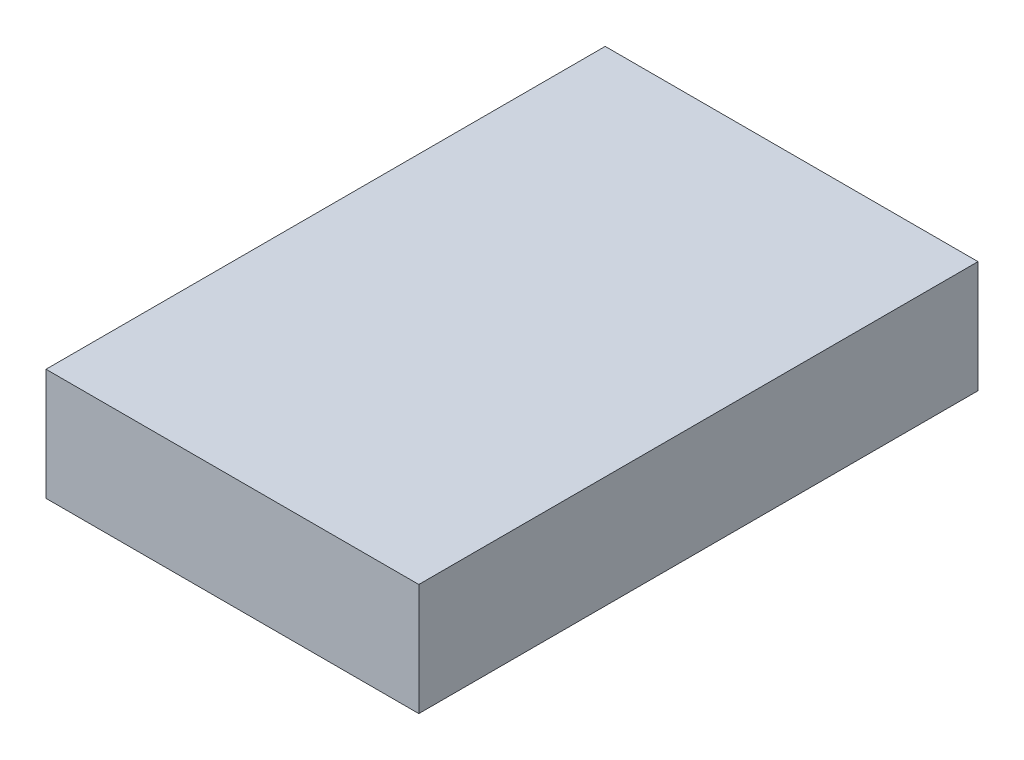
ISO-10303-21;
HEADER;
FILE_DESCRIPTION(('STEP AP214'),'2;1');
FILE_NAME('part.step','',(''),(''),'','','');
FILE_SCHEMA(('AUTOMOTIVE_DESIGN { 1 0 10303 214 1 1 1 1 }'));
ENDSEC;
DATA;
#1=APPLICATION_CONTEXT('core data for automotive mechanical design processes');
#2=APPLICATION_PROTOCOL_DEFINITION('international standard','automotive_design',2000,#1);
#3=PRODUCT_CONTEXT('',#1,'mechanical');
#4=PRODUCT('Part','Part','',(#3));
#5=PRODUCT_RELATED_PRODUCT_CATEGORY('part','',(#4));
#6=PRODUCT_DEFINITION_FORMATION('','',#4);
#7=PRODUCT_DEFINITION_CONTEXT('part definition',#1,'design');
#8=PRODUCT_DEFINITION('design','',#6,#7);
#9=PRODUCT_DEFINITION_SHAPE('','',#8);
#10=(LENGTH_UNIT() NAMED_UNIT(*) SI_UNIT(.MILLI.,.METRE.));
#11=(NAMED_UNIT(*) PLANE_ANGLE_UNIT() SI_UNIT($,.RADIAN.));
#12=(NAMED_UNIT(*) SI_UNIT($,.STERADIAN.) SOLID_ANGLE_UNIT());
#13=UNCERTAINTY_MEASURE_WITH_UNIT(LENGTH_MEASURE(1.E-05),#10,'distance_accuracy_value','');
#14=(GEOMETRIC_REPRESENTATION_CONTEXT(3) GLOBAL_UNCERTAINTY_ASSIGNED_CONTEXT((#13)) GLOBAL_UNIT_ASSIGNED_CONTEXT((#10,
#11,#12)) REPRESENTATION_CONTEXT('',''));
#15=CARTESIAN_POINT('',(0.,0.,0.));
#16=DIRECTION('',(0.,0.,1.));
#17=DIRECTION('',(1.,0.,0.));
#18=AXIS2_PLACEMENT_3D('',#15,#16,#17);
#19=CARTESIAN_POINT('',(-5.,-1.,-5.));
#20=DIRECTION('',(0.,-1.,0.));
#21=DIRECTION('',(0.,0.,-1.));
#22=AXIS2_PLACEMENT_3D('',#19,#20,#21);
#23=PLANE('',#22);
#24=DIRECTION('',(0.,0.,1.));
#25=VECTOR('',#24,1.);
#26=CARTESIAN_POINT('',(5.,-1.,-5.));
#27=LINE('',#26,#25);
#28=CARTESIAN_POINT('',(5.,-1.,-5.));
#29=VERTEX_POINT('',#28);
#30=CARTESIAN_POINT('',(5.,-1.,10.));
#31=VERTEX_POINT('',#30);
#32=EDGE_CURVE('E44',#29,#31,#27,.T.);
#33=ORIENTED_EDGE('',*,*,#32,.T.);
#34=DIRECTION('',(1.,0.,0.));
#35=VECTOR('',#34,1.);
#36=CARTESIAN_POINT('',(-5.,-1.,10.));
#37=LINE('',#36,#35);
#38=CARTESIAN_POINT('',(-5.,-1.,10.));
#39=VERTEX_POINT('',#38);
#40=EDGE_CURVE('E85',#39,#31,#37,.T.);
#41=ORIENTED_EDGE('',*,*,#40,.F.);
#42=DIRECTION('',(0.,0.,1.));
#43=VECTOR('',#42,1.);
#44=CARTESIAN_POINT('',(-5.,-1.,-5.));
#45=LINE('',#44,#43);
#46=CARTESIAN_POINT('',(-5.,-1.,-5.));
#47=VERTEX_POINT('',#46);
#48=EDGE_CURVE('E11',#47,#39,#45,.T.);
#49=ORIENTED_EDGE('',*,*,#48,.F.);
#50=DIRECTION('',(1.,0.,0.));
#51=VECTOR('',#50,1.);
#52=CARTESIAN_POINT('',(-5.,-1.,-5.));
#53=LINE('',#52,#51);
#54=EDGE_CURVE('E84',#47,#29,#53,.T.);
#55=ORIENTED_EDGE('',*,*,#54,.T.);
#56=EDGE_LOOP('',(#33,#41,#49,#55));
#57=FACE_BOUND('',#56,.T.);
#58=ADVANCED_FACE('F45',(#57),#23,.T.);
#59=CARTESIAN_POINT('',(-5.,-1.,-5.));
#60=DIRECTION('',(1.,0.,0.));
#61=DIRECTION('',(0.,0.,-1.));
#62=AXIS2_PLACEMENT_3D('',#59,#60,#61);
#63=PLANE('',#62);
#64=ORIENTED_EDGE('',*,*,#48,.T.);
#65=DIRECTION('',(0.,1.,0.));
#66=VECTOR('',#65,1.);
#67=CARTESIAN_POINT('',(-5.,-1.,10.));
#68=LINE('',#67,#66);
#69=CARTESIAN_POINT('',(-5.,2.,10.));
#70=VERTEX_POINT('',#69);
#71=EDGE_CURVE('E96',#39,#70,#68,.T.);
#72=ORIENTED_EDGE('',*,*,#71,.T.);
#73=DIRECTION('',(0.,0.,1.));
#74=VECTOR('',#73,1.);
#75=CARTESIAN_POINT('',(-5.,2.,-5.));
#76=LINE('',#75,#74);
#77=CARTESIAN_POINT('',(-5.,2.,-5.));
#78=VERTEX_POINT('',#77);
#79=EDGE_CURVE('E49',#78,#70,#76,.T.);
#80=ORIENTED_EDGE('',*,*,#79,.F.);
#81=DIRECTION('',(0.,1.,0.));
#82=VECTOR('',#81,1.);
#83=CARTESIAN_POINT('',(-5.,-1.,-5.));
#84=LINE('',#83,#82);
#85=EDGE_CURVE('E62',#47,#78,#84,.T.);
#86=ORIENTED_EDGE('',*,*,#85,.F.);
#87=EDGE_LOOP('',(#64,#72,#80,#86));
#88=FACE_BOUND('',#87,.T.);
#89=ADVANCED_FACE('F113',(#88),#63,.F.);
#90=CARTESIAN_POINT('',(-5.,2.,-5.));
#91=DIRECTION('',(0.,-1.,0.));
#92=DIRECTION('',(0.,0.,-1.));
#93=AXIS2_PLACEMENT_3D('',#90,#91,#92);
#94=PLANE('',#93);
#95=ORIENTED_EDGE('',*,*,#79,.T.);
#96=DIRECTION('',(1.,0.,0.));
#97=VECTOR('',#96,1.);
#98=CARTESIAN_POINT('',(-5.,2.,10.));
#99=LINE('',#98,#97);
#100=CARTESIAN_POINT('',(5.,2.,10.));
#101=VERTEX_POINT('',#100);
#102=EDGE_CURVE('E99',#70,#101,#99,.T.);
#103=ORIENTED_EDGE('',*,*,#102,.T.);
#104=DIRECTION('',(0.,0.,1.));
#105=VECTOR('',#104,1.);
#106=CARTESIAN_POINT('',(5.,2.,-5.));
#107=LINE('',#106,#105);
#108=CARTESIAN_POINT('',(5.,2.,-5.));
#109=VERTEX_POINT('',#108);
#110=EDGE_CURVE('E86',#109,#101,#107,.T.);
#111=ORIENTED_EDGE('',*,*,#110,.F.);
#112=DIRECTION('',(1.,0.,0.));
#113=VECTOR('',#112,1.);
#114=CARTESIAN_POINT('',(-5.,2.,-5.));
#115=LINE('',#114,#113);
#116=EDGE_CURVE('E107',#78,#109,#115,.T.);
#117=ORIENTED_EDGE('',*,*,#116,.F.);
#118=EDGE_LOOP('',(#95,#103,#111,#117));
#119=FACE_BOUND('',#118,.T.);
#120=ADVANCED_FACE('F114',(#119),#94,.F.);
#121=CARTESIAN_POINT('',(5.,2.,-5.));
#122=DIRECTION('',(-1.,0.,0.));
#123=DIRECTION('',(0.,0.,1.));
#124=AXIS2_PLACEMENT_3D('',#121,#122,#123);
#125=PLANE('',#124);
#126=ORIENTED_EDGE('',*,*,#110,.T.);
#127=DIRECTION('',(0.,-1.,0.));
#128=VECTOR('',#127,1.);
#129=CARTESIAN_POINT('',(5.,2.,10.));
#130=LINE('',#129,#128);
#131=EDGE_CURVE('E91',#101,#31,#130,.T.);
#132=ORIENTED_EDGE('',*,*,#131,.T.);
#133=ORIENTED_EDGE('',*,*,#32,.F.);
#134=DIRECTION('',(0.,-1.,0.));
#135=VECTOR('',#134,1.);
#136=CARTESIAN_POINT('',(5.,2.,-5.));
#137=LINE('',#136,#135);
#138=EDGE_CURVE('E106',#109,#29,#137,.T.);
#139=ORIENTED_EDGE('',*,*,#138,.F.);
#140=EDGE_LOOP('',(#126,#132,#133,#139));
#141=FACE_BOUND('',#140,.T.);
#142=ADVANCED_FACE('F98',(#141),#125,.F.);
#143=CARTESIAN_POINT('',(0.,0.,-5.));
#144=DIRECTION('',(0.,0.,-1.));
#145=DIRECTION('',(-1.,0.,0.));
#146=AXIS2_PLACEMENT_3D('',#143,#144,#145);
#147=PLANE('',#146);
#148=ORIENTED_EDGE('',*,*,#54,.F.);
#149=ORIENTED_EDGE('',*,*,#85,.T.);
#150=ORIENTED_EDGE('',*,*,#116,.T.);
#151=ORIENTED_EDGE('',*,*,#138,.T.);
#152=EDGE_LOOP('',(#148,#149,#150,#151));
#153=FACE_BOUND('',#152,.T.);
#154=ADVANCED_FACE('F118',(#153),#147,.T.);
#155=CARTESIAN_POINT('',(0.,0.,10.));
#156=DIRECTION('',(0.,0.,-1.));
#157=DIRECTION('',(-1.,0.,0.));
#158=AXIS2_PLACEMENT_3D('',#155,#156,#157);
#159=PLANE('',#158);
#160=ORIENTED_EDGE('',*,*,#40,.T.);
#161=ORIENTED_EDGE('',*,*,#131,.F.);
#162=ORIENTED_EDGE('',*,*,#102,.F.);
#163=ORIENTED_EDGE('',*,*,#71,.F.);
#164=EDGE_LOOP('',(#160,#161,#162,#163));
#165=FACE_BOUND('',#164,.T.);
#166=ADVANCED_FACE('F93',(#165),#159,.F.);
#167=CLOSED_SHELL('',(#58,#89,#120,#142,#154,#166));
#168=MANIFOLD_SOLID_BREP('B2',#167);
#169=ADVANCED_BREP_SHAPE_REPRESENTATION('',(#18,#168),#14);
#170=SHAPE_DEFINITION_REPRESENTATION(#9,#169);
ENDSEC;
END-ISO-10303-21;
